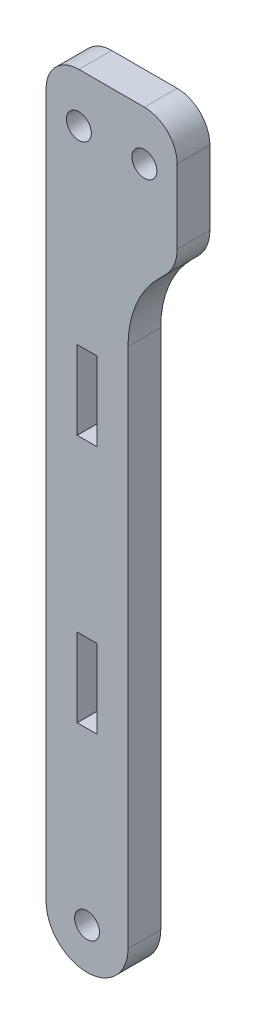
ISO-10303-21;
HEADER;
FILE_DESCRIPTION(('STEP AP214'),'2;1');
FILE_NAME('part.step','',(''),(''),'','','');
FILE_SCHEMA(('AUTOMOTIVE_DESIGN { 1 0 10303 214 1 1 1 1 }'));
ENDSEC;
DATA;
#1=APPLICATION_CONTEXT('core data for automotive mechanical design processes');
#2=APPLICATION_PROTOCOL_DEFINITION('international standard','automotive_design',2000,#1);
#3=PRODUCT_CONTEXT('',#1,'mechanical');
#4=PRODUCT('Part','Part','',(#3));
#5=PRODUCT_RELATED_PRODUCT_CATEGORY('part','',(#4));
#6=PRODUCT_DEFINITION_FORMATION('','',#4);
#7=PRODUCT_DEFINITION_CONTEXT('part definition',#1,'design');
#8=PRODUCT_DEFINITION('design','',#6,#7);
#9=PRODUCT_DEFINITION_SHAPE('','',#8);
#10=(LENGTH_UNIT() NAMED_UNIT(*) SI_UNIT(.MILLI.,.METRE.));
#11=(NAMED_UNIT(*) PLANE_ANGLE_UNIT() SI_UNIT($,.RADIAN.));
#12=(NAMED_UNIT(*) SI_UNIT($,.STERADIAN.) SOLID_ANGLE_UNIT());
#13=UNCERTAINTY_MEASURE_WITH_UNIT(LENGTH_MEASURE(1.E-05),#10,'distance_accuracy_value','');
#14=(GEOMETRIC_REPRESENTATION_CONTEXT(3) GLOBAL_UNCERTAINTY_ASSIGNED_CONTEXT((#13)) GLOBAL_UNIT_ASSIGNED_CONTEXT((#10,
#11,#12)) REPRESENTATION_CONTEXT('',''));
#15=CARTESIAN_POINT('',(0.,0.,0.));
#16=DIRECTION('',(0.,0.,1.));
#17=DIRECTION('',(1.,0.,0.));
#18=AXIS2_PLACEMENT_3D('',#15,#16,#17);
#19=CARTESIAN_POINT('',(3.04140763980065,54.9244302207132,5.));
#20=DIRECTION('',(0.,0.,1.));
#21=DIRECTION('',(1.,0.,0.));
#22=AXIS2_PLACEMENT_3D('',#19,#20,#21);
#23=PLANE('',#22);
#24=CARTESIAN_POINT('',(3.04140763980065,52.4244302207133,5.));
#25=DIRECTION('',(0.,0.,1.));
#26=DIRECTION('',(1.,0.,0.));
#27=AXIS2_PLACEMENT_3D('',#24,#25,#26);
#28=CIRCLE('',#27,1.90000000000001);
#29=CARTESIAN_POINT('',(4.94140763980067,52.4244302207133,5.));
#30=VERTEX_POINT('',#29);
#31=EDGE_CURVE('E231',#30,#30,#28,.T.);
#32=ORIENTED_EDGE('',*,*,#31,.F.);
#33=EDGE_LOOP('',(#32));
#34=FACE_BOUND('',#33,.T.);
#35=CARTESIAN_POINT('',(3.04140763980065,54.9244302207132,5.));
#36=DIRECTION('',(0.,0.,1.));
#37=DIRECTION('',(1.,0.,0.));
#38=AXIS2_PLACEMENT_3D('',#35,#36,#37);
#39=CIRCLE('',#38,4.99999999999997);
#40=CARTESIAN_POINT('',(8.0414076398007,54.9244302207132,5.));
#41=VERTEX_POINT('',#40);
#42=CARTESIAN_POINT('',(3.04140763980065,59.9244302207131,5.));
#43=VERTEX_POINT('',#42);
#44=EDGE_CURVE('E243',#41,#43,#39,.T.);
#45=ORIENTED_EDGE('',*,*,#44,.T.);
#46=DIRECTION('',(-1.,0.,0.));
#47=VECTOR('',#46,1.);
#48=CARTESIAN_POINT('',(-6.95859236019891,59.9244302207133,5.));
#49=LINE('',#48,#47);
#50=CARTESIAN_POINT('',(-6.95859236019891,59.9244302207135,5.));
#51=VERTEX_POINT('',#50);
#52=EDGE_CURVE('E246',#43,#51,#49,.T.);
#53=ORIENTED_EDGE('',*,*,#52,.T.);
#54=CARTESIAN_POINT('',(-6.95859236019891,54.9244302207132,5.));
#55=DIRECTION('',(0.,0.,1.));
#56=DIRECTION('',(1.,0.,0.));
#57=AXIS2_PLACEMENT_3D('',#54,#55,#56);
#58=CIRCLE('',#57,5.00000000000022);
#59=CARTESIAN_POINT('',(-11.9585923601993,54.9244302207132,5.));
#60=VERTEX_POINT('',#59);
#61=EDGE_CURVE('E249',#51,#60,#58,.T.);
#62=ORIENTED_EDGE('',*,*,#61,.T.);
#63=DIRECTION('',(0.,-1.,0.));
#64=VECTOR('',#63,1.);
#65=CARTESIAN_POINT('',(-11.958592360199,-52.5755697792873,5.));
#66=LINE('',#65,#64);
#67=CARTESIAN_POINT('',(-11.9585923601987,-52.5755697792873,5.));
#68=VERTEX_POINT('',#67);
#69=EDGE_CURVE('E251',#60,#68,#66,.T.);
#70=ORIENTED_EDGE('',*,*,#69,.T.);
#71=CARTESIAN_POINT('',(-5.70859236019888,-52.5755697792873,5.));
#72=DIRECTION('',(0.,0.,1.));
#73=DIRECTION('',(1.,0.,0.));
#74=AXIS2_PLACEMENT_3D('',#71,#72,#73);
#75=CIRCLE('',#74,6.24999999999981);
#76=CARTESIAN_POINT('',(0.541407639800651,-52.5755697792873,5.));
#77=VERTEX_POINT('',#76);
#78=EDGE_CURVE('E253',#68,#77,#75,.T.);
#79=ORIENTED_EDGE('',*,*,#78,.T.);
#80=DIRECTION('',(0.,1.,0.));
#81=VECTOR('',#80,1.);
#82=CARTESIAN_POINT('',(0.541407639800651,-52.5755697792873,5.));
#83=LINE('',#82,#81);
#84=CARTESIAN_POINT('',(0.541407639800612,27.0470132227441,5.));
#85=VERTEX_POINT('',#84);
#86=EDGE_CURVE('E255',#77,#85,#83,.T.);
#87=ORIENTED_EDGE('',*,*,#86,.T.);
#88=CARTESIAN_POINT('',(16.5414076398006,27.0470132227436,5.));
#89=DIRECTION('',(0.,0.,-1.));
#90=DIRECTION('',(1.,0.,0.));
#91=AXIS2_PLACEMENT_3D('',#88,#89,#90);
#92=CIRCLE('',#91,15.9999999999999);
#93=CARTESIAN_POINT('',(5.22769914081622,38.3607217217288,5.));
#94=VERTEX_POINT('',#93);
#95=EDGE_CURVE('E257',#85,#94,#92,.T.);
#96=ORIENTED_EDGE('',*,*,#95,.T.);
#97=DIRECTION('',(0.707106781186696,0.707106781186399,0.));
#98=VECTOR('',#97,1.);
#99=CARTESIAN_POINT('',(6.2840483269202,39.4170709078323,5.));
#100=LINE('',#99,#98);
#101=CARTESIAN_POINT('',(6.28404832692033,39.4170709078322,5.));
#102=VERTEX_POINT('',#101);
#103=EDGE_CURVE('E259',#94,#102,#100,.T.);
#104=ORIENTED_EDGE('',*,*,#103,.T.);
#105=CARTESIAN_POINT('',(2.04140763980076,43.6597115949513,5.));
#106=DIRECTION('',(0.,0.,1.));
#107=DIRECTION('',(1.,0.,0.));
#108=AXIS2_PLACEMENT_3D('',#105,#106,#107);
#109=CIRCLE('',#108,6.00000000000009);
#110=CARTESIAN_POINT('',(8.04140763980104,43.6597115949513,5.));
#111=VERTEX_POINT('',#110);
#112=EDGE_CURVE('E261',#102,#111,#109,.T.);
#113=ORIENTED_EDGE('',*,*,#112,.T.);
#114=DIRECTION('',(0.,1.,0.));
#115=VECTOR('',#114,1.);
#116=CARTESIAN_POINT('',(8.0414076398007,54.9244302207132,5.));
#117=LINE('',#116,#115);
#118=EDGE_CURVE('E263',#111,#41,#117,.T.);
#119=ORIENTED_EDGE('',*,*,#118,.T.);
#120=EDGE_LOOP('',(#45,#53,#62,#70,#79,#87,#96,#104,#113,#119));
#121=FACE_BOUND('',#120,.T.);
#122=CARTESIAN_POINT('',(-5.70859236019888,-52.5755697792873,5.));
#123=DIRECTION('',(0.,0.,1.));
#124=DIRECTION('',(1.,0.,0.));
#125=AXIS2_PLACEMENT_3D('',#122,#123,#124);
#126=CIRCLE('',#125,1.89999999999996);
#127=CARTESIAN_POINT('',(-3.80859236019893,-52.5755697792873,5.));
#128=VERTEX_POINT('',#127);
#129=EDGE_CURVE('E237',#128,#128,#126,.T.);
#130=ORIENTED_EDGE('',*,*,#129,.F.);
#131=EDGE_LOOP('',(#130));
#132=FACE_BOUND('',#131,.T.);
#133=CARTESIAN_POINT('',(-6.95859236019891,52.4244302207133,5.));
#134=DIRECTION('',(0.,0.,1.));
#135=DIRECTION('',(1.,0.,0.));
#136=AXIS2_PLACEMENT_3D('',#133,#134,#135);
#137=CIRCLE('',#136,1.90000000000001);
#138=CARTESIAN_POINT('',(-5.0585923601989,52.4244302207133,5.));
#139=VERTEX_POINT('',#138);
#140=EDGE_CURVE('E225',#139,#139,#137,.T.);
#141=ORIENTED_EDGE('',*,*,#140,.F.);
#142=EDGE_LOOP('',(#141));
#143=FACE_BOUND('',#142,.T.);
#144=DIRECTION('',(0.,1.,0.));
#145=VECTOR('',#144,1.);
#146=CARTESIAN_POINT('',(-4.20859236019888,23.4244302207132,5.));
#147=LINE('',#146,#145);
#148=CARTESIAN_POINT('',(-4.20859236019888,11.4244302207132,5.));
#149=VERTEX_POINT('',#148);
#150=CARTESIAN_POINT('',(-4.20859236019888,23.4244302207132,5.));
#151=VERTEX_POINT('',#150);
#152=EDGE_CURVE('E196',#149,#151,#147,.T.);
#153=ORIENTED_EDGE('',*,*,#152,.F.);
#154=DIRECTION('',(1.,0.,0.));
#155=VECTOR('',#154,1.);
#156=CARTESIAN_POINT('',(-7.20859236019888,11.4244302207132,5.));
#157=LINE('',#156,#155);
#158=CARTESIAN_POINT('',(-7.20859236019888,11.4244302207132,5.));
#159=VERTEX_POINT('',#158);
#160=EDGE_CURVE('E194',#159,#149,#157,.T.);
#161=ORIENTED_EDGE('',*,*,#160,.F.);
#162=DIRECTION('',(0.,-1.,0.));
#163=VECTOR('',#162,1.);
#164=CARTESIAN_POINT('',(-7.20859236019888,11.4244302207132,5.));
#165=LINE('',#164,#163);
#166=CARTESIAN_POINT('',(-7.20859236019888,23.4244302207132,5.));
#167=VERTEX_POINT('',#166);
#168=EDGE_CURVE('E202',#167,#159,#165,.T.);
#169=ORIENTED_EDGE('',*,*,#168,.F.);
#170=DIRECTION('',(-1.,0.,0.));
#171=VECTOR('',#170,1.);
#172=CARTESIAN_POINT('',(-7.20859236019888,23.4244302207132,5.));
#173=LINE('',#172,#171);
#174=EDGE_CURVE('E199',#151,#167,#173,.T.);
#175=ORIENTED_EDGE('',*,*,#174,.F.);
#176=EDGE_LOOP('',(#153,#161,#169,#175));
#177=FACE_BOUND('',#176,.T.);
#178=DIRECTION('',(-1.,0.,0.));
#179=VECTOR('',#178,1.);
#180=CARTESIAN_POINT('',(-4.20859236019888,-14.5755697792869,5.));
#181=LINE('',#180,#179);
#182=CARTESIAN_POINT('',(-4.20859236019888,-14.5755697792869,5.));
#183=VERTEX_POINT('',#182);
#184=CARTESIAN_POINT('',(-7.20859236019888,-14.5755697792869,5.));
#185=VERTEX_POINT('',#184);
#186=EDGE_CURVE('E166',#183,#185,#181,.T.);
#187=ORIENTED_EDGE('',*,*,#186,.F.);
#188=DIRECTION('',(0.,1.,0.));
#189=VECTOR('',#188,1.);
#190=CARTESIAN_POINT('',(-4.20859236019888,-14.5755697792869,5.));
#191=LINE('',#190,#189);
#192=CARTESIAN_POINT('',(-4.20859236019888,-26.5755697792873,5.));
#193=VERTEX_POINT('',#192);
#194=EDGE_CURVE('E158',#193,#183,#191,.T.);
#195=ORIENTED_EDGE('',*,*,#194,.F.);
#196=DIRECTION('',(1.,0.,0.));
#197=VECTOR('',#196,1.);
#198=CARTESIAN_POINT('',(-4.20859236019888,-26.5755697792873,5.));
#199=LINE('',#198,#197);
#200=CARTESIAN_POINT('',(-7.20859236019888,-26.5755697792873,5.));
#201=VERTEX_POINT('',#200);
#202=EDGE_CURVE('E180',#201,#193,#199,.T.);
#203=ORIENTED_EDGE('',*,*,#202,.F.);
#204=DIRECTION('',(0.,-1.,0.));
#205=VECTOR('',#204,1.);
#206=CARTESIAN_POINT('',(-7.20859236019888,-26.5755697792873,5.));
#207=LINE('',#206,#205);
#208=EDGE_CURVE('E178',#185,#201,#207,.T.);
#209=ORIENTED_EDGE('',*,*,#208,.F.);
#210=EDGE_LOOP('',(#187,#195,#203,#209));
#211=FACE_BOUND('',#210,.T.);
#212=ADVANCED_FACE('F33',(#34,#121,#132,#143,#177,#211),#23,.T.);
#213=CARTESIAN_POINT('',(3.04140763980065,54.9244302207132,0.));
#214=DIRECTION('',(0.,0.,1.));
#215=DIRECTION('',(1.,0.,0.));
#216=AXIS2_PLACEMENT_3D('',#213,#214,#215);
#217=PLANE('',#216);
#218=DIRECTION('',(1.,0.,0.));
#219=VECTOR('',#218,1.);
#220=CARTESIAN_POINT('',(-7.20859236019888,11.4244302207132,0.));
#221=LINE('',#220,#219);
#222=CARTESIAN_POINT('',(-7.20859236019888,11.4244302207132,0.));
#223=VERTEX_POINT('',#222);
#224=CARTESIAN_POINT('',(-4.20859236019888,11.4244302207132,0.));
#225=VERTEX_POINT('',#224);
#226=EDGE_CURVE('E174',#223,#225,#221,.T.);
#227=ORIENTED_EDGE('',*,*,#226,.T.);
#228=DIRECTION('',(0.,1.,0.));
#229=VECTOR('',#228,1.);
#230=CARTESIAN_POINT('',(-4.20859236019888,23.4244302207132,0.));
#231=LINE('',#230,#229);
#232=CARTESIAN_POINT('',(-4.20859236019888,23.4244302207132,0.));
#233=VERTEX_POINT('',#232);
#234=EDGE_CURVE('E207',#225,#233,#231,.T.);
#235=ORIENTED_EDGE('',*,*,#234,.T.);
#236=DIRECTION('',(-1.,0.,0.));
#237=VECTOR('',#236,1.);
#238=CARTESIAN_POINT('',(-7.20859236019888,23.4244302207132,0.));
#239=LINE('',#238,#237);
#240=CARTESIAN_POINT('',(-7.20859236019888,23.4244302207132,0.));
#241=VERTEX_POINT('',#240);
#242=EDGE_CURVE('E210',#233,#241,#239,.T.);
#243=ORIENTED_EDGE('',*,*,#242,.T.);
#244=DIRECTION('',(0.,-1.,0.));
#245=VECTOR('',#244,1.);
#246=CARTESIAN_POINT('',(-7.20859236019888,11.4244302207132,0.));
#247=LINE('',#246,#245);
#248=EDGE_CURVE('E197',#241,#223,#247,.T.);
#249=ORIENTED_EDGE('',*,*,#248,.T.);
#250=EDGE_LOOP('',(#227,#235,#243,#249));
#251=FACE_BOUND('',#250,.T.);
#252=CARTESIAN_POINT('',(3.04140763980065,54.9244302207132,0.));
#253=DIRECTION('',(0.,0.,1.));
#254=DIRECTION('',(1.,0.,0.));
#255=AXIS2_PLACEMENT_3D('',#252,#253,#254);
#256=CIRCLE('',#255,4.99999999999997);
#257=CARTESIAN_POINT('',(8.0414076398007,54.9244302207132,0.));
#258=VERTEX_POINT('',#257);
#259=CARTESIAN_POINT('',(3.04140763980065,59.9244302207131,0.));
#260=VERTEX_POINT('',#259);
#261=EDGE_CURVE('E240',#258,#260,#256,.T.);
#262=ORIENTED_EDGE('',*,*,#261,.F.);
#263=DIRECTION('',(0.,1.,0.));
#264=VECTOR('',#263,1.);
#265=CARTESIAN_POINT('',(8.0414076398007,54.9244302207132,0.));
#266=LINE('',#265,#264);
#267=CARTESIAN_POINT('',(8.04140763980104,43.6597115949513,0.));
#268=VERTEX_POINT('',#267);
#269=EDGE_CURVE('E247',#268,#258,#266,.T.);
#270=ORIENTED_EDGE('',*,*,#269,.F.);
#271=CARTESIAN_POINT('',(2.04140763980076,43.6597115949513,0.));
#272=DIRECTION('',(0.,0.,1.));
#273=DIRECTION('',(1.,0.,0.));
#274=AXIS2_PLACEMENT_3D('',#271,#272,#273);
#275=CIRCLE('',#274,6.00000000000009);
#276=CARTESIAN_POINT('',(6.28404832692033,39.4170709078322,0.));
#277=VERTEX_POINT('',#276);
#278=EDGE_CURVE('E282',#277,#268,#275,.T.);
#279=ORIENTED_EDGE('',*,*,#278,.F.);
#280=DIRECTION('',(0.707106781186696,0.707106781186399,0.));
#281=VECTOR('',#280,1.);
#282=CARTESIAN_POINT('',(6.2840483269202,39.4170709078323,0.));
#283=LINE('',#282,#281);
#284=CARTESIAN_POINT('',(5.22769914081622,38.3607217217288,0.));
#285=VERTEX_POINT('',#284);
#286=EDGE_CURVE('E280',#285,#277,#283,.T.);
#287=ORIENTED_EDGE('',*,*,#286,.F.);
#288=CARTESIAN_POINT('',(16.5414076398006,27.0470132227436,0.));
#289=DIRECTION('',(0.,0.,-1.));
#290=DIRECTION('',(1.,0.,0.));
#291=AXIS2_PLACEMENT_3D('',#288,#289,#290);
#292=CIRCLE('',#291,15.9999999999999);
#293=CARTESIAN_POINT('',(0.541407639800612,27.0470132227441,0.));
#294=VERTEX_POINT('',#293);
#295=EDGE_CURVE('E278',#294,#285,#292,.T.);
#296=ORIENTED_EDGE('',*,*,#295,.F.);
#297=DIRECTION('',(0.,1.,0.));
#298=VECTOR('',#297,1.);
#299=CARTESIAN_POINT('',(0.541407639800651,-52.5755697792873,0.));
#300=LINE('',#299,#298);
#301=CARTESIAN_POINT('',(0.541407639800651,-52.5755697792873,0.));
#302=VERTEX_POINT('',#301);
#303=EDGE_CURVE('E276',#302,#294,#300,.T.);
#304=ORIENTED_EDGE('',*,*,#303,.F.);
#305=CARTESIAN_POINT('',(-5.70859236019888,-52.5755697792873,0.));
#306=DIRECTION('',(0.,0.,1.));
#307=DIRECTION('',(1.,0.,0.));
#308=AXIS2_PLACEMENT_3D('',#305,#306,#307);
#309=CIRCLE('',#308,6.24999999999981);
#310=CARTESIAN_POINT('',(-11.9585923601987,-52.5755697792873,0.));
#311=VERTEX_POINT('',#310);
#312=EDGE_CURVE('E274',#311,#302,#309,.T.);
#313=ORIENTED_EDGE('',*,*,#312,.F.);
#314=DIRECTION('',(0.,-1.,0.));
#315=VECTOR('',#314,1.);
#316=CARTESIAN_POINT('',(-11.958592360199,-52.5755697792873,0.));
#317=LINE('',#316,#315);
#318=CARTESIAN_POINT('',(-11.9585923601993,54.9244302207132,0.));
#319=VERTEX_POINT('',#318);
#320=EDGE_CURVE('E272',#319,#311,#317,.T.);
#321=ORIENTED_EDGE('',*,*,#320,.F.);
#322=CARTESIAN_POINT('',(-6.95859236019891,54.9244302207132,0.));
#323=DIRECTION('',(0.,0.,1.));
#324=DIRECTION('',(1.,0.,0.));
#325=AXIS2_PLACEMENT_3D('',#322,#323,#324);
#326=CIRCLE('',#325,5.00000000000022);
#327=CARTESIAN_POINT('',(-6.95859236019891,59.9244302207135,0.));
#328=VERTEX_POINT('',#327);
#329=EDGE_CURVE('E270',#328,#319,#326,.T.);
#330=ORIENTED_EDGE('',*,*,#329,.F.);
#331=DIRECTION('',(-1.,0.,0.));
#332=VECTOR('',#331,1.);
#333=CARTESIAN_POINT('',(-6.95859236019891,59.9244302207133,0.));
#334=LINE('',#333,#332);
#335=EDGE_CURVE('E268',#260,#328,#334,.T.);
#336=ORIENTED_EDGE('',*,*,#335,.F.);
#337=EDGE_LOOP('',(#262,#270,#279,#287,#296,#304,#313,#321,#330,#336));
#338=FACE_BOUND('',#337,.T.);
#339=CARTESIAN_POINT('',(-5.70859236019888,-52.5755697792873,0.));
#340=DIRECTION('',(0.,0.,1.));
#341=DIRECTION('',(1.,0.,0.));
#342=AXIS2_PLACEMENT_3D('',#339,#340,#341);
#343=CIRCLE('',#342,1.89999999999996);
#344=CARTESIAN_POINT('',(-3.80859236019893,-52.5755697792873,0.));
#345=VERTEX_POINT('',#344);
#346=EDGE_CURVE('E234',#345,#345,#343,.T.);
#347=ORIENTED_EDGE('',*,*,#346,.T.);
#348=EDGE_LOOP('',(#347));
#349=FACE_BOUND('',#348,.T.);
#350=CARTESIAN_POINT('',(3.04140763980065,52.4244302207133,0.));
#351=DIRECTION('',(0.,0.,1.));
#352=DIRECTION('',(1.,0.,0.));
#353=AXIS2_PLACEMENT_3D('',#350,#351,#352);
#354=CIRCLE('',#353,1.90000000000001);
#355=CARTESIAN_POINT('',(4.94140763980067,52.4244302207133,0.));
#356=VERTEX_POINT('',#355);
#357=EDGE_CURVE('E228',#356,#356,#354,.T.);
#358=ORIENTED_EDGE('',*,*,#357,.T.);
#359=EDGE_LOOP('',(#358));
#360=FACE_BOUND('',#359,.T.);
#361=CARTESIAN_POINT('',(-6.95859236019891,52.4244302207133,0.));
#362=DIRECTION('',(0.,0.,1.));
#363=DIRECTION('',(1.,0.,0.));
#364=AXIS2_PLACEMENT_3D('',#361,#362,#363);
#365=CIRCLE('',#364,1.90000000000001);
#366=CARTESIAN_POINT('',(-5.0585923601989,52.4244302207133,0.));
#367=VERTEX_POINT('',#366);
#368=EDGE_CURVE('E224',#367,#367,#365,.T.);
#369=ORIENTED_EDGE('',*,*,#368,.T.);
#370=EDGE_LOOP('',(#369));
#371=FACE_BOUND('',#370,.T.);
#372=DIRECTION('',(0.,1.,0.));
#373=VECTOR('',#372,1.);
#374=CARTESIAN_POINT('',(-4.20859236019888,-14.5755697792869,0.));
#375=LINE('',#374,#373);
#376=CARTESIAN_POINT('',(-4.20859236019888,-26.5755697792873,0.));
#377=VERTEX_POINT('',#376);
#378=CARTESIAN_POINT('',(-4.20859236019888,-14.5755697792869,0.));
#379=VERTEX_POINT('',#378);
#380=EDGE_CURVE('E56',#377,#379,#375,.T.);
#381=ORIENTED_EDGE('',*,*,#380,.T.);
#382=DIRECTION('',(-1.,0.,0.));
#383=VECTOR('',#382,1.);
#384=CARTESIAN_POINT('',(-4.20859236019888,-14.5755697792869,0.));
#385=LINE('',#384,#383);
#386=CARTESIAN_POINT('',(-7.20859236019888,-14.5755697792869,0.));
#387=VERTEX_POINT('',#386);
#388=EDGE_CURVE('E173',#379,#387,#385,.T.);
#389=ORIENTED_EDGE('',*,*,#388,.T.);
#390=DIRECTION('',(0.,-1.,0.));
#391=VECTOR('',#390,1.);
#392=CARTESIAN_POINT('',(-7.20859236019888,-26.5755697792873,0.));
#393=LINE('',#392,#391);
#394=CARTESIAN_POINT('',(-7.20859236019888,-26.5755697792873,0.));
#395=VERTEX_POINT('',#394);
#396=EDGE_CURVE('E186',#387,#395,#393,.T.);
#397=ORIENTED_EDGE('',*,*,#396,.T.);
#398=DIRECTION('',(1.,0.,0.));
#399=VECTOR('',#398,1.);
#400=CARTESIAN_POINT('',(-4.20859236019888,-26.5755697792873,0.));
#401=LINE('',#400,#399);
#402=EDGE_CURVE('E167',#395,#377,#401,.T.);
#403=ORIENTED_EDGE('',*,*,#402,.T.);
#404=EDGE_LOOP('',(#381,#389,#397,#403));
#405=FACE_BOUND('',#404,.T.);
#406=ADVANCED_FACE('F318',(#251,#338,#349,#360,#371,#405),#217,.F.);
#407=CARTESIAN_POINT('',(3.04140763980065,54.9244302207132,5.));
#408=DIRECTION('',(0.,0.,-1.));
#409=DIRECTION('',(-1.,0.,0.));
#410=AXIS2_PLACEMENT_3D('',#407,#408,#409);
#411=CYLINDRICAL_SURFACE('',#410,4.99999999999997);
#412=ORIENTED_EDGE('',*,*,#261,.T.);
#413=DIRECTION('',(0.,0.,-1.));
#414=VECTOR('',#413,1.);
#415=CARTESIAN_POINT('',(3.04140763980065,59.9244302207131,5.));
#416=LINE('',#415,#414);
#417=EDGE_CURVE('E11',#43,#260,#416,.T.);
#418=ORIENTED_EDGE('',*,*,#417,.F.);
#419=ORIENTED_EDGE('',*,*,#44,.F.);
#420=DIRECTION('',(0.,0.,-1.));
#421=VECTOR('',#420,1.);
#422=CARTESIAN_POINT('',(8.0414076398007,54.9244302207132,5.));
#423=LINE('',#422,#421);
#424=EDGE_CURVE('E265',#41,#258,#423,.T.);
#425=ORIENTED_EDGE('',*,*,#424,.T.);
#426=EDGE_LOOP('',(#412,#418,#419,#425));
#427=FACE_BOUND('',#426,.T.);
#428=ADVANCED_FACE('F35',(#427),#411,.T.);
#429=CARTESIAN_POINT('',(-6.95859236019891,59.9244302207133,5.));
#430=DIRECTION('',(0.,-1.,0.));
#431=DIRECTION('',(1.,0.,0.));
#432=AXIS2_PLACEMENT_3D('',#429,#430,#431);
#433=PLANE('',#432);
#434=ORIENTED_EDGE('',*,*,#335,.T.);
#435=DIRECTION('',(0.,0.,-1.));
#436=VECTOR('',#435,1.);
#437=CARTESIAN_POINT('',(-6.95859236019891,59.9244302207135,5.));
#438=LINE('',#437,#436);
#439=EDGE_CURVE('E41',#51,#328,#438,.T.);
#440=ORIENTED_EDGE('',*,*,#439,.F.);
#441=ORIENTED_EDGE('',*,*,#52,.F.);
#442=ORIENTED_EDGE('',*,*,#417,.T.);
#443=EDGE_LOOP('',(#434,#440,#441,#442));
#444=FACE_BOUND('',#443,.T.);
#445=ADVANCED_FACE('F336',(#444),#433,.F.);
#446=CARTESIAN_POINT('',(-6.95859236019891,54.9244302207132,5.));
#447=DIRECTION('',(0.,0.,-1.));
#448=DIRECTION('',(-1.,0.,0.));
#449=AXIS2_PLACEMENT_3D('',#446,#447,#448);
#450=CYLINDRICAL_SURFACE('',#449,5.00000000000022);
#451=ORIENTED_EDGE('',*,*,#329,.T.);
#452=DIRECTION('',(0.,0.,-1.));
#453=VECTOR('',#452,1.);
#454=CARTESIAN_POINT('',(-11.9585923601993,54.9244302207132,5.));
#455=LINE('',#454,#453);
#456=EDGE_CURVE('E305',#60,#319,#455,.T.);
#457=ORIENTED_EDGE('',*,*,#456,.F.);
#458=ORIENTED_EDGE('',*,*,#61,.F.);
#459=ORIENTED_EDGE('',*,*,#439,.T.);
#460=EDGE_LOOP('',(#451,#457,#458,#459));
#461=FACE_BOUND('',#460,.T.);
#462=ADVANCED_FACE('F312',(#461),#450,.T.);
#463=CARTESIAN_POINT('',(-11.958592360199,-52.5755697792873,5.));
#464=DIRECTION('',(1.,0.,0.));
#465=DIRECTION('',(0.,1.,0.));
#466=AXIS2_PLACEMENT_3D('',#463,#464,#465);
#467=PLANE('',#466);
#468=ORIENTED_EDGE('',*,*,#320,.T.);
#469=DIRECTION('',(0.,0.,-1.));
#470=VECTOR('',#469,1.);
#471=CARTESIAN_POINT('',(-11.9585923601987,-52.5755697792873,5.));
#472=LINE('',#471,#470);
#473=EDGE_CURVE('E302',#68,#311,#472,.T.);
#474=ORIENTED_EDGE('',*,*,#473,.F.);
#475=ORIENTED_EDGE('',*,*,#69,.F.);
#476=ORIENTED_EDGE('',*,*,#456,.T.);
#477=EDGE_LOOP('',(#468,#474,#475,#476));
#478=FACE_BOUND('',#477,.T.);
#479=ADVANCED_FACE('F324',(#478),#467,.F.);
#480=CARTESIAN_POINT('',(-5.70859236019888,-52.5755697792873,5.));
#481=DIRECTION('',(0.,0.,-1.));
#482=DIRECTION('',(-1.,0.,0.));
#483=AXIS2_PLACEMENT_3D('',#480,#481,#482);
#484=CYLINDRICAL_SURFACE('',#483,6.24999999999981);
#485=ORIENTED_EDGE('',*,*,#312,.T.);
#486=DIRECTION('',(0.,0.,-1.));
#487=VECTOR('',#486,1.);
#488=CARTESIAN_POINT('',(0.541407639800651,-52.5755697792873,5.));
#489=LINE('',#488,#487);
#490=EDGE_CURVE('E299',#77,#302,#489,.T.);
#491=ORIENTED_EDGE('',*,*,#490,.F.);
#492=ORIENTED_EDGE('',*,*,#78,.F.);
#493=ORIENTED_EDGE('',*,*,#473,.T.);
#494=EDGE_LOOP('',(#485,#491,#492,#493));
#495=FACE_BOUND('',#494,.T.);
#496=ADVANCED_FACE('F328',(#495),#484,.T.);
#497=CARTESIAN_POINT('',(0.541407639800651,-52.5755697792873,5.));
#498=DIRECTION('',(-1.,0.,0.));
#499=DIRECTION('',(0.,0.,1.));
#500=AXIS2_PLACEMENT_3D('',#497,#498,#499);
#501=PLANE('',#500);
#502=ORIENTED_EDGE('',*,*,#303,.T.);
#503=DIRECTION('',(0.,0.,-1.));
#504=VECTOR('',#503,1.);
#505=CARTESIAN_POINT('',(0.541407639800612,27.0470132227441,5.));
#506=LINE('',#505,#504);
#507=EDGE_CURVE('E296',#85,#294,#506,.T.);
#508=ORIENTED_EDGE('',*,*,#507,.F.);
#509=ORIENTED_EDGE('',*,*,#86,.F.);
#510=ORIENTED_EDGE('',*,*,#490,.T.);
#511=EDGE_LOOP('',(#502,#508,#509,#510));
#512=FACE_BOUND('',#511,.T.);
#513=ADVANCED_FACE('F359',(#512),#501,.F.);
#514=CARTESIAN_POINT('',(16.5414076398006,27.0470132227436,5.));
#515=DIRECTION('',(0.,0.,-1.));
#516=DIRECTION('',(-1.,0.,0.));
#517=AXIS2_PLACEMENT_3D('',#514,#515,#516);
#518=CYLINDRICAL_SURFACE('',#517,15.9999999999999);
#519=ORIENTED_EDGE('',*,*,#295,.T.);
#520=DIRECTION('',(0.,0.,-1.));
#521=VECTOR('',#520,1.);
#522=CARTESIAN_POINT('',(5.22769914081622,38.3607217217288,5.));
#523=LINE('',#522,#521);
#524=EDGE_CURVE('E293',#94,#285,#523,.T.);
#525=ORIENTED_EDGE('',*,*,#524,.F.);
#526=ORIENTED_EDGE('',*,*,#95,.F.);
#527=ORIENTED_EDGE('',*,*,#507,.T.);
#528=EDGE_LOOP('',(#519,#525,#526,#527));
#529=FACE_BOUND('',#528,.T.);
#530=ADVANCED_FACE('F356',(#529),#518,.F.);
#531=CARTESIAN_POINT('',(6.2840483269202,39.4170709078323,5.));
#532=DIRECTION('',(-0.707106781186399,0.707106781186696,0.));
#533=DIRECTION('',(-0.707106781186696,-0.707106781186399,0.));
#534=AXIS2_PLACEMENT_3D('',#531,#532,#533);
#535=PLANE('',#534);
#536=ORIENTED_EDGE('',*,*,#286,.T.);
#537=DIRECTION('',(0.,0.,-1.));
#538=VECTOR('',#537,1.);
#539=CARTESIAN_POINT('',(6.28404832692033,39.4170709078322,5.));
#540=LINE('',#539,#538);
#541=EDGE_CURVE('E290',#102,#277,#540,.T.);
#542=ORIENTED_EDGE('',*,*,#541,.F.);
#543=ORIENTED_EDGE('',*,*,#103,.F.);
#544=ORIENTED_EDGE('',*,*,#524,.T.);
#545=EDGE_LOOP('',(#536,#542,#543,#544));
#546=FACE_BOUND('',#545,.T.);
#547=ADVANCED_FACE('F352',(#546),#535,.F.);
#548=CARTESIAN_POINT('',(2.04140763980076,43.6597115949513,5.));
#549=DIRECTION('',(0.,0.,-1.));
#550=DIRECTION('',(-1.,0.,0.));
#551=AXIS2_PLACEMENT_3D('',#548,#549,#550);
#552=CYLINDRICAL_SURFACE('',#551,6.00000000000009);
#553=ORIENTED_EDGE('',*,*,#278,.T.);
#554=DIRECTION('',(0.,0.,-1.));
#555=VECTOR('',#554,1.);
#556=CARTESIAN_POINT('',(8.04140763980104,43.6597115949513,5.));
#557=LINE('',#556,#555);
#558=EDGE_CURVE('E287',#111,#268,#557,.T.);
#559=ORIENTED_EDGE('',*,*,#558,.F.);
#560=ORIENTED_EDGE('',*,*,#112,.F.);
#561=ORIENTED_EDGE('',*,*,#541,.T.);
#562=EDGE_LOOP('',(#553,#559,#560,#561));
#563=FACE_BOUND('',#562,.T.);
#564=ADVANCED_FACE('F348',(#563),#552,.T.);
#565=CARTESIAN_POINT('',(8.0414076398007,54.9244302207132,5.));
#566=DIRECTION('',(-1.,0.,0.));
#567=DIRECTION('',(0.,-1.,0.));
#568=AXIS2_PLACEMENT_3D('',#565,#566,#567);
#569=PLANE('',#568);
#570=ORIENTED_EDGE('',*,*,#269,.T.);
#571=ORIENTED_EDGE('',*,*,#424,.F.);
#572=ORIENTED_EDGE('',*,*,#118,.F.);
#573=ORIENTED_EDGE('',*,*,#558,.T.);
#574=EDGE_LOOP('',(#570,#571,#572,#573));
#575=FACE_BOUND('',#574,.T.);
#576=ADVANCED_FACE('F343',(#575),#569,.F.);
#577=CARTESIAN_POINT('',(-5.70859236019888,-52.5755697792873,5.));
#578=DIRECTION('',(0.,0.,-1.));
#579=DIRECTION('',(-1.,0.,0.));
#580=AXIS2_PLACEMENT_3D('',#577,#578,#579);
#581=CYLINDRICAL_SURFACE('',#580,1.89999999999996);
#582=ORIENTED_EDGE('',*,*,#129,.T.);
#583=EDGE_LOOP('',(#582));
#584=FACE_BOUND('',#583,.T.);
#585=ORIENTED_EDGE('',*,*,#346,.F.);
#586=EDGE_LOOP('',(#585));
#587=FACE_BOUND('',#586,.T.);
#588=ADVANCED_FACE('F378',(#584,#587),#581,.F.);
#589=CARTESIAN_POINT('',(3.04140763980065,52.4244302207133,5.));
#590=DIRECTION('',(0.,0.,-1.));
#591=DIRECTION('',(-1.,0.,0.));
#592=AXIS2_PLACEMENT_3D('',#589,#590,#591);
#593=CYLINDRICAL_SURFACE('',#592,1.90000000000001);
#594=ORIENTED_EDGE('',*,*,#31,.T.);
#595=EDGE_LOOP('',(#594));
#596=FACE_BOUND('',#595,.T.);
#597=ORIENTED_EDGE('',*,*,#357,.F.);
#598=EDGE_LOOP('',(#597));
#599=FACE_BOUND('',#598,.T.);
#600=ADVANCED_FACE('F404',(#596,#599),#593,.F.);
#601=CARTESIAN_POINT('',(-6.95859236019891,52.4244302207133,5.));
#602=DIRECTION('',(0.,0.,-1.));
#603=DIRECTION('',(-1.,0.,0.));
#604=AXIS2_PLACEMENT_3D('',#601,#602,#603);
#605=CYLINDRICAL_SURFACE('',#604,1.90000000000001);
#606=ORIENTED_EDGE('',*,*,#140,.T.);
#607=EDGE_LOOP('',(#606));
#608=FACE_BOUND('',#607,.T.);
#609=ORIENTED_EDGE('',*,*,#368,.F.);
#610=EDGE_LOOP('',(#609));
#611=FACE_BOUND('',#610,.T.);
#612=ADVANCED_FACE('F411',(#608,#611),#605,.F.);
#613=CARTESIAN_POINT('',(-7.20859236019888,11.4244302207132,5.));
#614=DIRECTION('',(0.,1.,0.));
#615=DIRECTION('',(0.,0.,1.));
#616=AXIS2_PLACEMENT_3D('',#613,#614,#615);
#617=PLANE('',#616);
#618=ORIENTED_EDGE('',*,*,#226,.F.);
#619=DIRECTION('',(0.,0.,-1.));
#620=VECTOR('',#619,1.);
#621=CARTESIAN_POINT('',(-7.20859236019888,11.4244302207132,5.));
#622=LINE('',#621,#620);
#623=EDGE_CURVE('E204',#159,#223,#622,.T.);
#624=ORIENTED_EDGE('',*,*,#623,.F.);
#625=ORIENTED_EDGE('',*,*,#160,.T.);
#626=DIRECTION('',(0.,0.,-1.));
#627=VECTOR('',#626,1.);
#628=CARTESIAN_POINT('',(-4.20859236019888,11.4244302207132,5.));
#629=LINE('',#628,#627);
#630=EDGE_CURVE('E221',#149,#225,#629,.T.);
#631=ORIENTED_EDGE('',*,*,#630,.T.);
#632=EDGE_LOOP('',(#618,#624,#625,#631));
#633=FACE_BOUND('',#632,.T.);
#634=ADVANCED_FACE('F418',(#633),#617,.T.);
#635=CARTESIAN_POINT('',(-4.20859236019888,23.4244302207132,5.));
#636=DIRECTION('',(-1.,0.,0.));
#637=DIRECTION('',(0.,-1.,0.));
#638=AXIS2_PLACEMENT_3D('',#635,#636,#637);
#639=PLANE('',#638);
#640=ORIENTED_EDGE('',*,*,#234,.F.);
#641=ORIENTED_EDGE('',*,*,#630,.F.);
#642=ORIENTED_EDGE('',*,*,#152,.T.);
#643=DIRECTION('',(0.,0.,-1.));
#644=VECTOR('',#643,1.);
#645=CARTESIAN_POINT('',(-4.20859236019888,23.4244302207132,5.));
#646=LINE('',#645,#644);
#647=EDGE_CURVE('E219',#151,#233,#646,.T.);
#648=ORIENTED_EDGE('',*,*,#647,.T.);
#649=EDGE_LOOP('',(#640,#641,#642,#648));
#650=FACE_BOUND('',#649,.T.);
#651=ADVANCED_FACE('F426',(#650),#639,.T.);
#652=CARTESIAN_POINT('',(-7.20859236019888,23.4244302207132,5.));
#653=DIRECTION('',(0.,-1.,0.));
#654=DIRECTION('',(0.,0.,-1.));
#655=AXIS2_PLACEMENT_3D('',#652,#653,#654);
#656=PLANE('',#655);
#657=ORIENTED_EDGE('',*,*,#242,.F.);
#658=ORIENTED_EDGE('',*,*,#647,.F.);
#659=ORIENTED_EDGE('',*,*,#174,.T.);
#660=DIRECTION('',(0.,0.,-1.));
#661=VECTOR('',#660,1.);
#662=CARTESIAN_POINT('',(-7.20859236019888,23.4244302207132,5.));
#663=LINE('',#662,#661);
#664=EDGE_CURVE('E217',#167,#241,#663,.T.);
#665=ORIENTED_EDGE('',*,*,#664,.T.);
#666=EDGE_LOOP('',(#657,#658,#659,#665));
#667=FACE_BOUND('',#666,.T.);
#668=ADVANCED_FACE('F434',(#667),#656,.T.);
#669=CARTESIAN_POINT('',(-7.20859236019888,11.4244302207132,5.));
#670=DIRECTION('',(1.,0.,0.));
#671=DIRECTION('',(0.,0.,-1.));
#672=AXIS2_PLACEMENT_3D('',#669,#670,#671);
#673=PLANE('',#672);
#674=ORIENTED_EDGE('',*,*,#248,.F.);
#675=ORIENTED_EDGE('',*,*,#664,.F.);
#676=ORIENTED_EDGE('',*,*,#168,.T.);
#677=ORIENTED_EDGE('',*,*,#623,.T.);
#678=EDGE_LOOP('',(#674,#675,#676,#677));
#679=FACE_BOUND('',#678,.T.);
#680=ADVANCED_FACE('F442',(#679),#673,.T.);
#681=CARTESIAN_POINT('',(-4.20859236019888,-14.5755697792869,5.));
#682=DIRECTION('',(-1.,0.,0.));
#683=DIRECTION('',(0.,-1.,0.));
#684=AXIS2_PLACEMENT_3D('',#681,#682,#683);
#685=PLANE('',#684);
#686=ORIENTED_EDGE('',*,*,#380,.F.);
#687=DIRECTION('',(0.,0.,-1.));
#688=VECTOR('',#687,1.);
#689=CARTESIAN_POINT('',(-4.20859236019888,-26.5755697792873,5.));
#690=LINE('',#689,#688);
#691=EDGE_CURVE('E162',#193,#377,#690,.T.);
#692=ORIENTED_EDGE('',*,*,#691,.F.);
#693=ORIENTED_EDGE('',*,*,#194,.T.);
#694=DIRECTION('',(0.,0.,-1.));
#695=VECTOR('',#694,1.);
#696=CARTESIAN_POINT('',(-4.20859236019888,-14.5755697792869,5.));
#697=LINE('',#696,#695);
#698=EDGE_CURVE('E161',#183,#379,#697,.T.);
#699=ORIENTED_EDGE('',*,*,#698,.T.);
#700=EDGE_LOOP('',(#686,#692,#693,#699));
#701=FACE_BOUND('',#700,.T.);
#702=ADVANCED_FACE('F160',(#701),#685,.T.);
#703=CARTESIAN_POINT('',(-4.20859236019888,-14.5755697792869,5.));
#704=DIRECTION('',(0.,-1.,0.));
#705=DIRECTION('',(1.,0.,0.));
#706=AXIS2_PLACEMENT_3D('',#703,#704,#705);
#707=PLANE('',#706);
#708=ORIENTED_EDGE('',*,*,#388,.F.);
#709=ORIENTED_EDGE('',*,*,#698,.F.);
#710=ORIENTED_EDGE('',*,*,#186,.T.);
#711=DIRECTION('',(0.,0.,-1.));
#712=VECTOR('',#711,1.);
#713=CARTESIAN_POINT('',(-7.20859236019888,-14.5755697792869,5.));
#714=LINE('',#713,#712);
#715=EDGE_CURVE('E175',#185,#387,#714,.T.);
#716=ORIENTED_EDGE('',*,*,#715,.T.);
#717=EDGE_LOOP('',(#708,#709,#710,#716));
#718=FACE_BOUND('',#717,.T.);
#719=ADVANCED_FACE('F170',(#718),#707,.T.);
#720=CARTESIAN_POINT('',(-7.20859236019888,-26.5755697792873,5.));
#721=DIRECTION('',(1.,0.,0.));
#722=DIRECTION('',(0.,0.,-1.));
#723=AXIS2_PLACEMENT_3D('',#720,#721,#722);
#724=PLANE('',#723);
#725=ORIENTED_EDGE('',*,*,#396,.F.);
#726=ORIENTED_EDGE('',*,*,#715,.F.);
#727=ORIENTED_EDGE('',*,*,#208,.T.);
#728=DIRECTION('',(0.,0.,-1.));
#729=VECTOR('',#728,1.);
#730=CARTESIAN_POINT('',(-7.20859236019888,-26.5755697792873,5.));
#731=LINE('',#730,#729);
#732=EDGE_CURVE('E48',#201,#395,#731,.T.);
#733=ORIENTED_EDGE('',*,*,#732,.T.);
#734=EDGE_LOOP('',(#725,#726,#727,#733));
#735=FACE_BOUND('',#734,.T.);
#736=ADVANCED_FACE('F463',(#735),#724,.T.);
#737=CARTESIAN_POINT('',(-4.20859236019888,-26.5755697792873,5.));
#738=DIRECTION('',(0.,1.,0.));
#739=DIRECTION('',(0.,0.,1.));
#740=AXIS2_PLACEMENT_3D('',#737,#738,#739);
#741=PLANE('',#740);
#742=ORIENTED_EDGE('',*,*,#402,.F.);
#743=ORIENTED_EDGE('',*,*,#732,.F.);
#744=ORIENTED_EDGE('',*,*,#202,.T.);
#745=ORIENTED_EDGE('',*,*,#691,.T.);
#746=EDGE_LOOP('',(#742,#743,#744,#745));
#747=FACE_BOUND('',#746,.T.);
#748=ADVANCED_FACE('F470',(#747),#741,.T.);
#749=CLOSED_SHELL('',(#212,#406,#428,#445,#462,#479,#496,#513,#530,#547,#564,#576,#588,#600,
#612,#634,#651,#668,#680,#702,#719,#736,#748));
#750=MANIFOLD_SOLID_BREP('B2',#749);
#751=ADVANCED_BREP_SHAPE_REPRESENTATION('',(#18,#750),#14);
#752=SHAPE_DEFINITION_REPRESENTATION(#9,#751);
ENDSEC;
END-ISO-10303-21;
